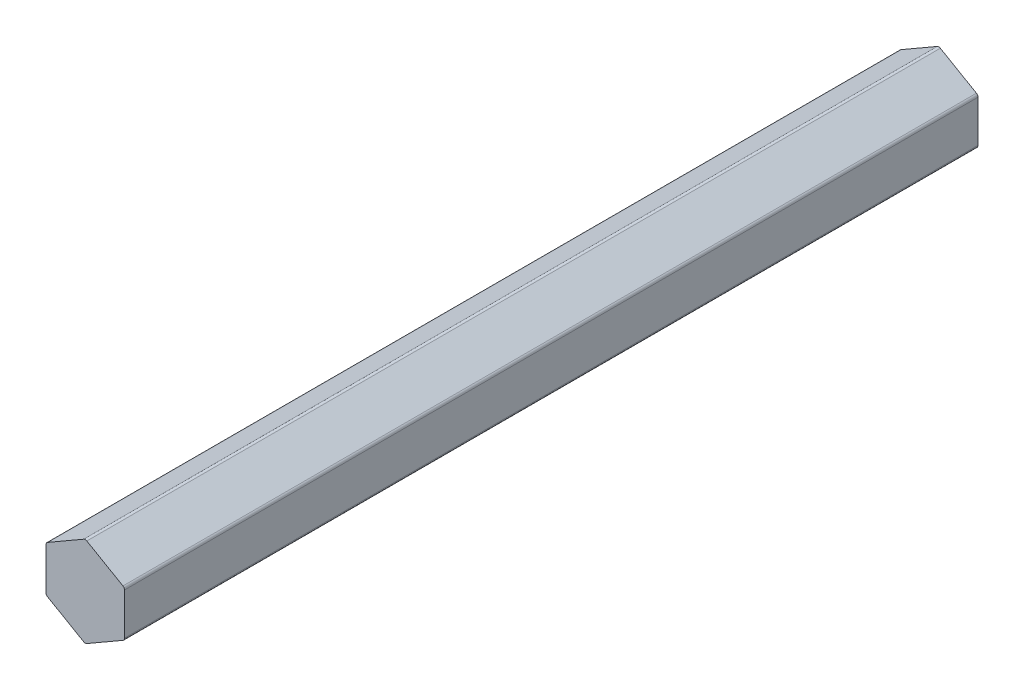
ISO-10303-21;
HEADER;
FILE_DESCRIPTION(('STEP AP214'),'2;1');
FILE_NAME('part.step','',(''),(''),'','','');
FILE_SCHEMA(('AUTOMOTIVE_DESIGN { 1 0 10303 214 1 1 1 1 }'));
ENDSEC;
DATA;
#1=APPLICATION_CONTEXT('core data for automotive mechanical design processes');
#2=APPLICATION_PROTOCOL_DEFINITION('international standard','automotive_design',2000,#1);
#3=PRODUCT_CONTEXT('',#1,'mechanical');
#4=PRODUCT('Part','Part','',(#3));
#5=PRODUCT_RELATED_PRODUCT_CATEGORY('part','',(#4));
#6=PRODUCT_DEFINITION_FORMATION('','',#4);
#7=PRODUCT_DEFINITION_CONTEXT('part definition',#1,'design');
#8=PRODUCT_DEFINITION('design','',#6,#7);
#9=PRODUCT_DEFINITION_SHAPE('','',#8);
#10=(LENGTH_UNIT() NAMED_UNIT(*) SI_UNIT(.MILLI.,.METRE.));
#11=(NAMED_UNIT(*) PLANE_ANGLE_UNIT() SI_UNIT($,.RADIAN.));
#12=(NAMED_UNIT(*) SI_UNIT($,.STERADIAN.) SOLID_ANGLE_UNIT());
#13=UNCERTAINTY_MEASURE_WITH_UNIT(LENGTH_MEASURE(1.E-05),#10,'distance_accuracy_value','');
#14=(GEOMETRIC_REPRESENTATION_CONTEXT(3) GLOBAL_UNCERTAINTY_ASSIGNED_CONTEXT((#13)) GLOBAL_UNIT_ASSIGNED_CONTEXT((#10,
#11,#12)) REPRESENTATION_CONTEXT('',''));
#15=CARTESIAN_POINT('',(0.,0.,0.));
#16=DIRECTION('',(0.,0.,1.));
#17=DIRECTION('',(1.,0.,0.));
#18=AXIS2_PLACEMENT_3D('',#15,#16,#17);
#19=CARTESIAN_POINT('',(0.,0.,0.));
#20=DIRECTION('',(0.,0.,1.));
#21=DIRECTION('',(1.,0.,0.));
#22=AXIS2_PLACEMENT_3D('',#19,#20,#21);
#23=PLANE('',#22);
#24=DIRECTION('',(0.866025403784439,-0.5,0.));
#25=VECTOR('',#24,1.);
#26=CARTESIAN_POINT('',(-6.35,-3.66617420935413,0.));
#27=LINE('',#26,#25);
#28=CARTESIAN_POINT('',(-6.096,-3.81282117772829,0.));
#29=VERTEX_POINT('',#28);
#30=CARTESIAN_POINT('',(-0.254000000000003,-7.18570145033408,0.));
#31=VERTEX_POINT('',#30);
#32=EDGE_CURVE('E130',#29,#31,#27,.T.);
#33=ORIENTED_EDGE('',*,*,#32,.F.);
#34=CARTESIAN_POINT('',(-5.842,-3.3728802726058,0.));
#35=DIRECTION('',(0.,0.,1.));
#36=DIRECTION('',(1.,0.,0.));
#37=AXIS2_PLACEMENT_3D('',#34,#35,#36);
#38=CIRCLE('',#37,0.508);
#39=CARTESIAN_POINT('',(-6.35,-3.3728802726058,0.));
#40=VERTEX_POINT('',#39);
#41=EDGE_CURVE('E209',#29,#40,#38,.F.);
#42=ORIENTED_EDGE('',*,*,#41,.T.);
#43=DIRECTION('',(0.,-1.,0.));
#44=VECTOR('',#43,1.);
#45=CARTESIAN_POINT('',(-6.35,3.66617420935413,0.));
#46=LINE('',#45,#44);
#47=CARTESIAN_POINT('',(-6.35,3.3728802726058,0.));
#48=VERTEX_POINT('',#47);
#49=EDGE_CURVE('E184',#48,#40,#46,.T.);
#50=ORIENTED_EDGE('',*,*,#49,.F.);
#51=CARTESIAN_POINT('',(-5.842,3.3728802726058,0.));
#52=DIRECTION('',(0.,0.,1.));
#53=DIRECTION('',(1.,0.,0.));
#54=AXIS2_PLACEMENT_3D('',#51,#52,#53);
#55=CIRCLE('',#54,0.508);
#56=CARTESIAN_POINT('',(-6.096,3.81282117772829,0.));
#57=VERTEX_POINT('',#56);
#58=EDGE_CURVE('E203',#48,#57,#55,.F.);
#59=ORIENTED_EDGE('',*,*,#58,.T.);
#60=DIRECTION('',(-0.866025403784439,-0.5,0.));
#61=VECTOR('',#60,1.);
#62=CARTESIAN_POINT('',(0.,7.33234841870825,0.));
#63=LINE('',#62,#61);
#64=CARTESIAN_POINT('',(-0.254000000000001,7.18570145033408,0.));
#65=VERTEX_POINT('',#64);
#66=EDGE_CURVE('E181',#65,#57,#63,.T.);
#67=ORIENTED_EDGE('',*,*,#66,.F.);
#68=CARTESIAN_POINT('',(0.,6.74576054521159,0.));
#69=DIRECTION('',(0.,0.,1.));
#70=DIRECTION('',(1.,0.,0.));
#71=AXIS2_PLACEMENT_3D('',#68,#69,#70);
#72=CIRCLE('',#71,0.508);
#73=CARTESIAN_POINT('',(0.254,7.18570145033408,0.));
#74=VERTEX_POINT('',#73);
#75=EDGE_CURVE('E180',#65,#74,#72,.F.);
#76=ORIENTED_EDGE('',*,*,#75,.T.);
#77=DIRECTION('',(-0.866025403784439,0.5,0.));
#78=VECTOR('',#77,1.);
#79=CARTESIAN_POINT('',(6.35,3.66617420935412,0.));
#80=LINE('',#79,#78);
#81=CARTESIAN_POINT('',(6.096,3.81282117772829,0.));
#82=VERTEX_POINT('',#81);
#83=EDGE_CURVE('E173',#82,#74,#80,.T.);
#84=ORIENTED_EDGE('',*,*,#83,.F.);
#85=CARTESIAN_POINT('',(5.842,3.37288027260579,0.));
#86=DIRECTION('',(0.,0.,1.));
#87=DIRECTION('',(1.,0.,0.));
#88=AXIS2_PLACEMENT_3D('',#85,#86,#87);
#89=CIRCLE('',#88,0.508);
#90=CARTESIAN_POINT('',(6.35,3.37288027260579,0.));
#91=VERTEX_POINT('',#90);
#92=EDGE_CURVE('E177',#82,#91,#89,.F.);
#93=ORIENTED_EDGE('',*,*,#92,.T.);
#94=DIRECTION('',(0.,1.,0.));
#95=VECTOR('',#94,1.);
#96=CARTESIAN_POINT('',(6.35,-3.66617420935413,0.));
#97=LINE('',#96,#95);
#98=CARTESIAN_POINT('',(6.35,-3.3728802726058,0.));
#99=VERTEX_POINT('',#98);
#100=EDGE_CURVE('E195',#99,#91,#97,.T.);
#101=ORIENTED_EDGE('',*,*,#100,.F.);
#102=CARTESIAN_POINT('',(5.842,-3.3728802726058,0.));
#103=DIRECTION('',(0.,0.,1.));
#104=DIRECTION('',(1.,0.,0.));
#105=AXIS2_PLACEMENT_3D('',#102,#103,#104);
#106=CIRCLE('',#105,0.508);
#107=CARTESIAN_POINT('',(6.096,-3.81282117772829,0.));
#108=VERTEX_POINT('',#107);
#109=EDGE_CURVE('E205',#99,#108,#106,.F.);
#110=ORIENTED_EDGE('',*,*,#109,.T.);
#111=DIRECTION('',(0.866025403784439,0.5,0.));
#112=VECTOR('',#111,1.);
#113=CARTESIAN_POINT('',(0.,-7.33234841870825,0.));
#114=LINE('',#113,#112);
#115=CARTESIAN_POINT('',(0.253999999999998,-7.18570145033408,0.));
#116=VERTEX_POINT('',#115);
#117=EDGE_CURVE('E192',#116,#108,#114,.T.);
#118=ORIENTED_EDGE('',*,*,#117,.F.);
#119=CARTESIAN_POINT('',(0.,-6.74576054521159,0.));
#120=DIRECTION('',(0.,0.,1.));
#121=DIRECTION('',(1.,0.,0.));
#122=AXIS2_PLACEMENT_3D('',#119,#120,#121);
#123=CIRCLE('',#122,0.508);
#124=EDGE_CURVE('E207',#116,#31,#123,.F.);
#125=ORIENTED_EDGE('',*,*,#124,.T.);
#126=EDGE_LOOP('',(#33,#42,#50,#59,#67,#76,#84,#93,#101,#110,#118,#125));
#127=FACE_BOUND('',#126,.T.);
#128=ADVANCED_FACE('F33',(#127),#23,.F.);
#129=CARTESIAN_POINT('',(6.35,-3.66617420935413,157.459600441979));
#130=DIRECTION('',(-1.,0.,0.));
#131=DIRECTION('',(0.,0.,1.));
#132=AXIS2_PLACEMENT_3D('',#129,#130,#131);
#133=PLANE('',#132);
#134=DIRECTION('',(0.,-1.,0.));
#135=VECTOR('',#134,1.);
#136=CARTESIAN_POINT('',(6.35,-3.66617420935413,138.06003));
#137=LINE('',#136,#135);
#138=CARTESIAN_POINT('',(6.35,3.37288027260579,138.06003));
#139=VERTEX_POINT('',#138);
#140=CARTESIAN_POINT('',(6.35,-3.3728802726058,138.06003));
#141=VERTEX_POINT('',#140);
#142=EDGE_CURVE('E197',#139,#141,#137,.T.);
#143=ORIENTED_EDGE('',*,*,#142,.T.);
#144=DIRECTION('',(0.,0.,-1.));
#145=VECTOR('',#144,1.);
#146=CARTESIAN_POINT('',(6.35,-3.3728802726058,157.459600441979));
#147=LINE('',#146,#145);
#148=EDGE_CURVE('E162',#141,#99,#147,.T.);
#149=ORIENTED_EDGE('',*,*,#148,.T.);
#150=ORIENTED_EDGE('',*,*,#100,.T.);
#151=DIRECTION('',(0.,0.,-1.));
#152=VECTOR('',#151,1.);
#153=CARTESIAN_POINT('',(6.35,3.37288027260579,157.459600441979));
#154=LINE('',#153,#152);
#155=EDGE_CURVE('E160',#91,#139,#154,.F.);
#156=ORIENTED_EDGE('',*,*,#155,.T.);
#157=EDGE_LOOP('',(#143,#149,#150,#156));
#158=FACE_BOUND('',#157,.T.);
#159=ADVANCED_FACE('F248',(#158),#133,.F.);
#160=CARTESIAN_POINT('',(0.,-7.33234841870825,157.459600441979));
#161=DIRECTION('',(-0.5,0.866025403784439,0.));
#162=DIRECTION('',(-0.866025403784439,-0.5,0.));
#163=AXIS2_PLACEMENT_3D('',#160,#161,#162);
#164=PLANE('',#163);
#165=DIRECTION('',(-0.866025403784439,-0.5,0.));
#166=VECTOR('',#165,1.);
#167=CARTESIAN_POINT('',(0.,-7.33234841870825,138.06003));
#168=LINE('',#167,#166);
#169=CARTESIAN_POINT('',(6.096,-3.81282117772829,138.06003));
#170=VERTEX_POINT('',#169);
#171=CARTESIAN_POINT('',(0.253999999999998,-7.18570145033408,138.06003));
#172=VERTEX_POINT('',#171);
#173=EDGE_CURVE('E144',#170,#172,#168,.T.);
#174=ORIENTED_EDGE('',*,*,#173,.T.);
#175=DIRECTION('',(0.,0.,-1.));
#176=VECTOR('',#175,1.);
#177=CARTESIAN_POINT('',(0.253999999999998,-7.18570145033408,157.459600441979));
#178=LINE('',#177,#176);
#179=EDGE_CURVE('E149',#172,#116,#178,.T.);
#180=ORIENTED_EDGE('',*,*,#179,.T.);
#181=ORIENTED_EDGE('',*,*,#117,.T.);
#182=DIRECTION('',(0.,0.,-1.));
#183=VECTOR('',#182,1.);
#184=CARTESIAN_POINT('',(6.096,-3.81282117772829,157.459600441979));
#185=LINE('',#184,#183);
#186=EDGE_CURVE('E152',#108,#170,#185,.F.);
#187=ORIENTED_EDGE('',*,*,#186,.T.);
#188=EDGE_LOOP('',(#174,#180,#181,#187));
#189=FACE_BOUND('',#188,.T.);
#190=ADVANCED_FACE('F240',(#189),#164,.F.);
#191=CARTESIAN_POINT('',(-6.35,-3.66617420935413,157.459600441979));
#192=DIRECTION('',(0.5,0.866025403784439,0.));
#193=DIRECTION('',(-0.866025403784439,0.5,0.));
#194=AXIS2_PLACEMENT_3D('',#191,#192,#193);
#195=PLANE('',#194);
#196=DIRECTION('',(-0.866025403784439,0.5,0.));
#197=VECTOR('',#196,1.);
#198=CARTESIAN_POINT('',(-6.35,-3.66617420935413,138.06003));
#199=LINE('',#198,#197);
#200=CARTESIAN_POINT('',(-0.254000000000001,-7.18570145033408,138.06003));
#201=VERTEX_POINT('',#200);
#202=CARTESIAN_POINT('',(-6.096,-3.81282117772829,138.06003));
#203=VERTEX_POINT('',#202);
#204=EDGE_CURVE('E127',#201,#203,#199,.T.);
#205=ORIENTED_EDGE('',*,*,#204,.T.);
#206=DIRECTION('',(0.,0.,-1.));
#207=VECTOR('',#206,1.);
#208=CARTESIAN_POINT('',(-6.096,-3.81282117772829,157.459600441979));
#209=LINE('',#208,#207);
#210=EDGE_CURVE('E133',#203,#29,#209,.T.);
#211=ORIENTED_EDGE('',*,*,#210,.T.);
#212=ORIENTED_EDGE('',*,*,#32,.T.);
#213=DIRECTION('',(0.,0.,-1.));
#214=VECTOR('',#213,1.);
#215=CARTESIAN_POINT('',(-0.254000000000002,-7.18570145033408,157.459600441979));
#216=LINE('',#215,#214);
#217=EDGE_CURVE('E123',#31,#201,#216,.F.);
#218=ORIENTED_EDGE('',*,*,#217,.T.);
#219=EDGE_LOOP('',(#205,#211,#212,#218));
#220=FACE_BOUND('',#219,.T.);
#221=ADVANCED_FACE('F125',(#220),#195,.F.);
#222=CARTESIAN_POINT('',(-6.35,3.66617420935413,157.459600441979));
#223=DIRECTION('',(1.,0.,0.));
#224=DIRECTION('',(0.,0.,-1.));
#225=AXIS2_PLACEMENT_3D('',#222,#223,#224);
#226=PLANE('',#225);
#227=ORIENTED_EDGE('',*,*,#49,.T.);
#228=DIRECTION('',(0.,0.,-1.));
#229=VECTOR('',#228,1.);
#230=CARTESIAN_POINT('',(-6.35,-3.3728802726058,157.459600441979));
#231=LINE('',#230,#229);
#232=CARTESIAN_POINT('',(-6.35,-3.3728802726058,138.06003));
#233=VERTEX_POINT('',#232);
#234=EDGE_CURVE('E214',#40,#233,#231,.F.);
#235=ORIENTED_EDGE('',*,*,#234,.T.);
#236=DIRECTION('',(0.,1.,0.));
#237=VECTOR('',#236,1.);
#238=CARTESIAN_POINT('',(-6.35,3.66617420935412,138.06003));
#239=LINE('',#238,#237);
#240=CARTESIAN_POINT('',(-6.35,3.3728802726058,138.06003));
#241=VERTEX_POINT('',#240);
#242=EDGE_CURVE('E143',#233,#241,#239,.T.);
#243=ORIENTED_EDGE('',*,*,#242,.T.);
#244=DIRECTION('',(0.,0.,-1.));
#245=VECTOR('',#244,1.);
#246=CARTESIAN_POINT('',(-6.35,3.3728802726058,157.459600441979));
#247=LINE('',#246,#245);
#248=EDGE_CURVE('E211',#241,#48,#247,.T.);
#249=ORIENTED_EDGE('',*,*,#248,.T.);
#250=EDGE_LOOP('',(#227,#235,#243,#249));
#251=FACE_BOUND('',#250,.T.);
#252=ADVANCED_FACE('F227',(#251),#226,.F.);
#253=CARTESIAN_POINT('',(0.,7.33234841870825,157.459600441979));
#254=DIRECTION('',(0.5,-0.866025403784439,0.));
#255=DIRECTION('',(0.866025403784439,0.5,0.));
#256=AXIS2_PLACEMENT_3D('',#253,#254,#255);
#257=PLANE('',#256);
#258=ORIENTED_EDGE('',*,*,#66,.T.);
#259=DIRECTION('',(0.,0.,-1.));
#260=VECTOR('',#259,1.);
#261=CARTESIAN_POINT('',(-6.096,3.81282117772829,157.459600441979));
#262=LINE('',#261,#260);
#263=CARTESIAN_POINT('',(-6.096,3.81282117772829,138.06003));
#264=VERTEX_POINT('',#263);
#265=EDGE_CURVE('E168',#57,#264,#262,.F.);
#266=ORIENTED_EDGE('',*,*,#265,.T.);
#267=DIRECTION('',(0.866025403784439,0.5,0.));
#268=VECTOR('',#267,1.);
#269=CARTESIAN_POINT('',(0.,7.33234841870825,138.06003));
#270=LINE('',#269,#268);
#271=CARTESIAN_POINT('',(-0.254000000000001,7.18570145033408,138.06003));
#272=VERTEX_POINT('',#271);
#273=EDGE_CURVE('E222',#264,#272,#270,.T.);
#274=ORIENTED_EDGE('',*,*,#273,.T.);
#275=DIRECTION('',(0.,0.,-1.));
#276=VECTOR('',#275,1.);
#277=CARTESIAN_POINT('',(-0.254000000000001,7.18570145033408,157.459600441979));
#278=LINE('',#277,#276);
#279=EDGE_CURVE('E165',#272,#65,#278,.T.);
#280=ORIENTED_EDGE('',*,*,#279,.T.);
#281=EDGE_LOOP('',(#258,#266,#274,#280));
#282=FACE_BOUND('',#281,.T.);
#283=ADVANCED_FACE('F233',(#282),#257,.F.);
#284=CARTESIAN_POINT('',(6.35,3.66617420935412,157.459600441979));
#285=DIRECTION('',(-0.5,-0.866025403784439,0.));
#286=DIRECTION('',(0.866025403784439,-0.5,0.));
#287=AXIS2_PLACEMENT_3D('',#284,#285,#286);
#288=PLANE('',#287);
#289=ORIENTED_EDGE('',*,*,#83,.T.);
#290=DIRECTION('',(0.,0.,-1.));
#291=VECTOR('',#290,1.);
#292=CARTESIAN_POINT('',(0.253999999999998,7.18570145033408,157.459600441979));
#293=LINE('',#292,#291);
#294=CARTESIAN_POINT('',(0.253999999999999,7.18570145033408,138.06003));
#295=VERTEX_POINT('',#294);
#296=EDGE_CURVE('E11',#74,#295,#293,.F.);
#297=ORIENTED_EDGE('',*,*,#296,.T.);
#298=DIRECTION('',(0.866025403784439,-0.5,0.));
#299=VECTOR('',#298,1.);
#300=CARTESIAN_POINT('',(6.35,3.66617420935412,138.06003));
#301=LINE('',#300,#299);
#302=CARTESIAN_POINT('',(6.096,3.81282117772829,138.06003));
#303=VERTEX_POINT('',#302);
#304=EDGE_CURVE('E134',#295,#303,#301,.T.);
#305=ORIENTED_EDGE('',*,*,#304,.T.);
#306=DIRECTION('',(0.,0.,-1.));
#307=VECTOR('',#306,1.);
#308=CARTESIAN_POINT('',(6.096,3.81282117772829,157.459600441979));
#309=LINE('',#308,#307);
#310=EDGE_CURVE('E41',#303,#82,#309,.T.);
#311=ORIENTED_EDGE('',*,*,#310,.T.);
#312=EDGE_LOOP('',(#289,#297,#305,#311));
#313=FACE_BOUND('',#312,.T.);
#314=ADVANCED_FACE('F172',(#313),#288,.F.);
#315=CARTESIAN_POINT('',(0.,0.,138.06003));
#316=DIRECTION('',(0.,0.,-1.));
#317=DIRECTION('',(0.798934107454449,0.601418566346237,0.));
#318=AXIS2_PLACEMENT_3D('',#315,#316,#317);
#319=PLANE('',#318);
#320=ORIENTED_EDGE('',*,*,#242,.F.);
#321=CARTESIAN_POINT('',(-5.842,-3.3728802726058,138.06003));
#322=DIRECTION('',(0.,0.,-1.));
#323=DIRECTION('',(0.,1.,0.));
#324=AXIS2_PLACEMENT_3D('',#321,#322,#323);
#325=CIRCLE('',#324,0.508);
#326=EDGE_CURVE('E142',#233,#203,#325,.F.);
#327=ORIENTED_EDGE('',*,*,#326,.T.);
#328=ORIENTED_EDGE('',*,*,#204,.F.);
#329=CARTESIAN_POINT('',(0.,-6.74576054521159,138.06003));
#330=DIRECTION('',(0.,0.,-1.));
#331=DIRECTION('',(0.,1.,0.));
#332=AXIS2_PLACEMENT_3D('',#329,#330,#331);
#333=CIRCLE('',#332,0.508);
#334=EDGE_CURVE('E139',#201,#172,#333,.F.);
#335=ORIENTED_EDGE('',*,*,#334,.T.);
#336=ORIENTED_EDGE('',*,*,#173,.F.);
#337=CARTESIAN_POINT('',(5.842,-3.3728802726058,138.06003));
#338=DIRECTION('',(0.,0.,-1.));
#339=DIRECTION('',(0.,1.,0.));
#340=AXIS2_PLACEMENT_3D('',#337,#338,#339);
#341=CIRCLE('',#340,0.508);
#342=EDGE_CURVE('E150',#170,#141,#341,.F.);
#343=ORIENTED_EDGE('',*,*,#342,.T.);
#344=ORIENTED_EDGE('',*,*,#142,.F.);
#345=CARTESIAN_POINT('',(5.842,3.37288027260579,138.06003));
#346=DIRECTION('',(0.,0.,-1.));
#347=DIRECTION('',(0.,1.,0.));
#348=AXIS2_PLACEMENT_3D('',#345,#346,#347);
#349=CIRCLE('',#348,0.508);
#350=EDGE_CURVE('E48',#139,#303,#349,.F.);
#351=ORIENTED_EDGE('',*,*,#350,.T.);
#352=ORIENTED_EDGE('',*,*,#304,.F.);
#353=CARTESIAN_POINT('',(0.,6.74576054521159,138.06003));
#354=DIRECTION('',(0.,0.,-1.));
#355=DIRECTION('',(0.,1.,0.));
#356=AXIS2_PLACEMENT_3D('',#353,#354,#355);
#357=CIRCLE('',#356,0.508);
#358=EDGE_CURVE('E217',#295,#272,#357,.F.);
#359=ORIENTED_EDGE('',*,*,#358,.T.);
#360=ORIENTED_EDGE('',*,*,#273,.F.);
#361=CARTESIAN_POINT('',(-5.842,3.3728802726058,138.06003));
#362=DIRECTION('',(0.,0.,-1.));
#363=DIRECTION('',(0.,1.,0.));
#364=AXIS2_PLACEMENT_3D('',#361,#362,#363);
#365=CIRCLE('',#364,0.508);
#366=EDGE_CURVE('E154',#264,#241,#365,.F.);
#367=ORIENTED_EDGE('',*,*,#366,.T.);
#368=EDGE_LOOP('',(#320,#327,#328,#335,#336,#343,#344,#351,#352,#359,#360,#367));
#369=FACE_BOUND('',#368,.T.);
#370=ADVANCED_FACE('F137',(#369),#319,.F.);
#371=CARTESIAN_POINT('',(-5.842,-3.3728802726058,157.459600441979));
#372=DIRECTION('',(0.,0.,-1.));
#373=DIRECTION('',(-1.,0.,0.));
#374=AXIS2_PLACEMENT_3D('',#371,#372,#373);
#375=CYLINDRICAL_SURFACE('',#374,0.508);
#376=ORIENTED_EDGE('',*,*,#326,.F.);
#377=ORIENTED_EDGE('',*,*,#234,.F.);
#378=ORIENTED_EDGE('',*,*,#41,.F.);
#379=ORIENTED_EDGE('',*,*,#210,.F.);
#380=EDGE_LOOP('',(#376,#377,#378,#379));
#381=FACE_BOUND('',#380,.T.);
#382=ADVANCED_FACE('F251',(#381),#375,.T.);
#383=CARTESIAN_POINT('',(0.,-6.74576054521159,157.459600441979));
#384=DIRECTION('',(0.,0.,-1.));
#385=DIRECTION('',(-1.,0.,0.));
#386=AXIS2_PLACEMENT_3D('',#383,#384,#385);
#387=CYLINDRICAL_SURFACE('',#386,0.508);
#388=ORIENTED_EDGE('',*,*,#334,.F.);
#389=ORIENTED_EDGE('',*,*,#217,.F.);
#390=ORIENTED_EDGE('',*,*,#124,.F.);
#391=ORIENTED_EDGE('',*,*,#179,.F.);
#392=EDGE_LOOP('',(#388,#389,#390,#391));
#393=FACE_BOUND('',#392,.T.);
#394=ADVANCED_FACE('F147',(#393),#387,.T.);
#395=CARTESIAN_POINT('',(5.842,-3.3728802726058,157.459600441979));
#396=DIRECTION('',(0.,0.,-1.));
#397=DIRECTION('',(-1.,0.,0.));
#398=AXIS2_PLACEMENT_3D('',#395,#396,#397);
#399=CYLINDRICAL_SURFACE('',#398,0.508);
#400=ORIENTED_EDGE('',*,*,#342,.F.);
#401=ORIENTED_EDGE('',*,*,#186,.F.);
#402=ORIENTED_EDGE('',*,*,#109,.F.);
#403=ORIENTED_EDGE('',*,*,#148,.F.);
#404=EDGE_LOOP('',(#400,#401,#402,#403));
#405=FACE_BOUND('',#404,.T.);
#406=ADVANCED_FACE('F246',(#405),#399,.T.);
#407=CARTESIAN_POINT('',(-5.842,3.3728802726058,157.459600441979));
#408=DIRECTION('',(0.,0.,-1.));
#409=DIRECTION('',(-1.,0.,0.));
#410=AXIS2_PLACEMENT_3D('',#407,#408,#409);
#411=CYLINDRICAL_SURFACE('',#410,0.508);
#412=ORIENTED_EDGE('',*,*,#366,.F.);
#413=ORIENTED_EDGE('',*,*,#265,.F.);
#414=ORIENTED_EDGE('',*,*,#58,.F.);
#415=ORIENTED_EDGE('',*,*,#248,.F.);
#416=EDGE_LOOP('',(#412,#413,#414,#415));
#417=FACE_BOUND('',#416,.T.);
#418=ADVANCED_FACE('F231',(#417),#411,.T.);
#419=CARTESIAN_POINT('',(0.,6.74576054521159,157.459600441979));
#420=DIRECTION('',(0.,0.,-1.));
#421=DIRECTION('',(-1.,0.,0.));
#422=AXIS2_PLACEMENT_3D('',#419,#420,#421);
#423=CYLINDRICAL_SURFACE('',#422,0.508);
#424=ORIENTED_EDGE('',*,*,#358,.F.);
#425=ORIENTED_EDGE('',*,*,#296,.F.);
#426=ORIENTED_EDGE('',*,*,#75,.F.);
#427=ORIENTED_EDGE('',*,*,#279,.F.);
#428=EDGE_LOOP('',(#424,#425,#426,#427));
#429=FACE_BOUND('',#428,.T.);
#430=ADVANCED_FACE('F237',(#429),#423,.T.);
#431=CARTESIAN_POINT('',(5.842,3.37288027260579,157.459600441979));
#432=DIRECTION('',(0.,0.,-1.));
#433=DIRECTION('',(-1.,0.,0.));
#434=AXIS2_PLACEMENT_3D('',#431,#432,#433);
#435=CYLINDRICAL_SURFACE('',#434,0.508);
#436=ORIENTED_EDGE('',*,*,#350,.F.);
#437=ORIENTED_EDGE('',*,*,#155,.F.);
#438=ORIENTED_EDGE('',*,*,#92,.F.);
#439=ORIENTED_EDGE('',*,*,#310,.F.);
#440=EDGE_LOOP('',(#436,#437,#438,#439));
#441=FACE_BOUND('',#440,.T.);
#442=ADVANCED_FACE('F35',(#441),#435,.T.);
#443=CLOSED_SHELL('',(#128,#159,#190,#221,#252,#283,#314,#370,#382,#394,#406,#418,#430,#442));
#444=MANIFOLD_SOLID_BREP('B2',#443);
#445=ADVANCED_BREP_SHAPE_REPRESENTATION('',(#18,#444),#14);
#446=SHAPE_DEFINITION_REPRESENTATION(#9,#445);
ENDSEC;
END-ISO-10303-21;
